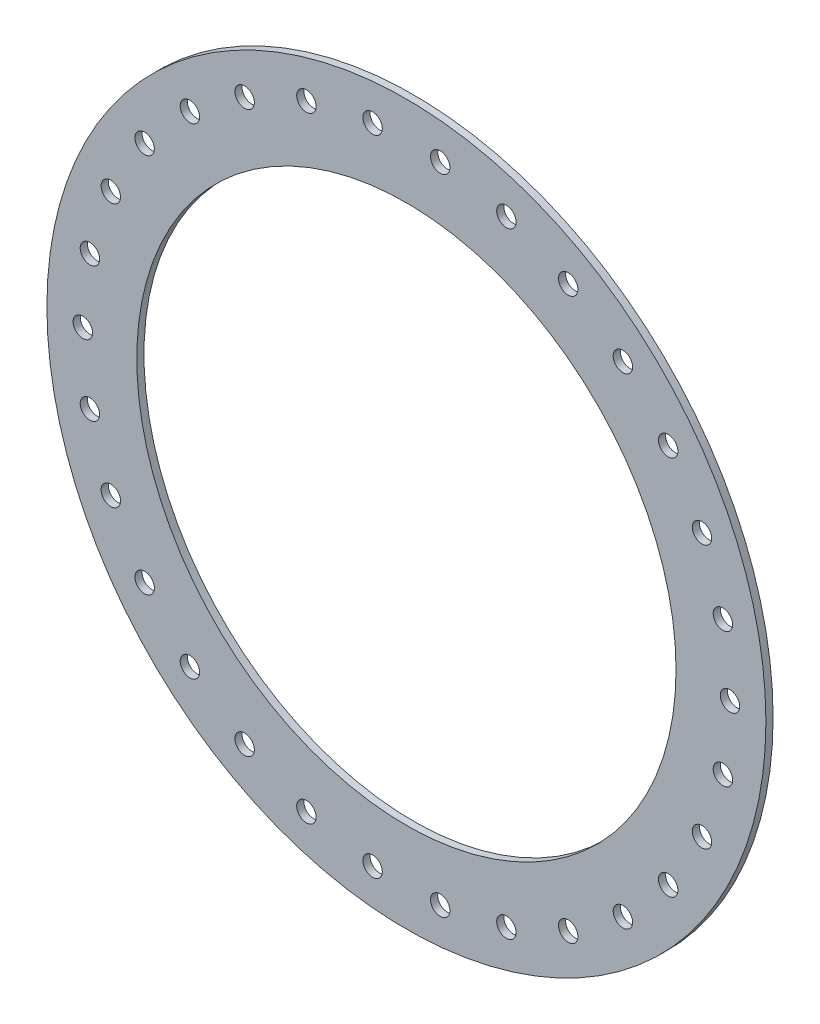
ISO-10303-21;
HEADER;
FILE_DESCRIPTION(('STEP AP214'),'2;1');
FILE_NAME('part.step','',(''),(''),'','','');
FILE_SCHEMA(('AUTOMOTIVE_DESIGN { 1 0 10303 214 1 1 1 1 }'));
ENDSEC;
DATA;
#1=APPLICATION_CONTEXT('core data for automotive mechanical design processes');
#2=APPLICATION_PROTOCOL_DEFINITION('international standard','automotive_design',2000,#1);
#3=PRODUCT_CONTEXT('',#1,'mechanical');
#4=PRODUCT('Part','Part','',(#3));
#5=PRODUCT_RELATED_PRODUCT_CATEGORY('part','',(#4));
#6=PRODUCT_DEFINITION_FORMATION('','',#4);
#7=PRODUCT_DEFINITION_CONTEXT('part definition',#1,'design');
#8=PRODUCT_DEFINITION('design','',#6,#7);
#9=PRODUCT_DEFINITION_SHAPE('','',#8);
#10=(LENGTH_UNIT() NAMED_UNIT(*) SI_UNIT(.MILLI.,.METRE.));
#11=(NAMED_UNIT(*) PLANE_ANGLE_UNIT() SI_UNIT($,.RADIAN.));
#12=(NAMED_UNIT(*) SI_UNIT($,.STERADIAN.) SOLID_ANGLE_UNIT());
#13=UNCERTAINTY_MEASURE_WITH_UNIT(LENGTH_MEASURE(1.E-05),#10,'distance_accuracy_value','');
#14=(GEOMETRIC_REPRESENTATION_CONTEXT(3) GLOBAL_UNCERTAINTY_ASSIGNED_CONTEXT((#13)) GLOBAL_UNIT_ASSIGNED_CONTEXT((#10,
#11,#12)) REPRESENTATION_CONTEXT('',''));
#15=CARTESIAN_POINT('',(0.,0.,0.));
#16=DIRECTION('',(0.,0.,1.));
#17=DIRECTION('',(1.,0.,0.));
#18=AXIS2_PLACEMENT_3D('',#15,#16,#17);
#19=CARTESIAN_POINT('',(0.,0.,4.));
#20=DIRECTION('',(0.,0.,1.));
#21=DIRECTION('',(1.,0.,0.));
#22=AXIS2_PLACEMENT_3D('',#19,#20,#21);
#23=PLANE('',#22);
#24=CARTESIAN_POINT('',(90.0000000000002,155.884572681199,4.));
#25=DIRECTION('',(0.,0.,1.));
#26=DIRECTION('',(1.,0.,0.));
#27=AXIS2_PLACEMENT_3D('',#24,#25,#26);
#28=CIRCLE('',#27,5.39999999999904);
#29=CARTESIAN_POINT('',(95.3999999999992,155.884572681199,4.));
#30=VERTEX_POINT('',#29);
#31=EDGE_CURVE('E217',#30,#30,#28,.T.);
#32=ORIENTED_EDGE('',*,*,#31,.F.);
#33=EDGE_LOOP('',(#32));
#34=FACE_BOUND('',#33,.T.);
#35=CARTESIAN_POINT('',(18.8151233881785,179.013941166289,4.));
#36=DIRECTION('',(0.,0.,1.));
#37=DIRECTION('',(1.,0.,0.));
#38=AXIS2_PLACEMENT_3D('',#35,#36,#37);
#39=CIRCLE('',#38,5.39999999999827);
#40=CARTESIAN_POINT('',(24.2151233881768,179.013941166289,4.));
#41=VERTEX_POINT('',#40);
#42=EDGE_CURVE('E205',#41,#41,#39,.T.);
#43=ORIENTED_EDGE('',*,*,#42,.F.);
#44=EDGE_LOOP('',(#43));
#45=FACE_BOUND('',#44,.T.);
#46=CARTESIAN_POINT('',(-55.6230589874907,171.190172933128,4.));
#47=DIRECTION('',(0.,0.,1.));
#48=DIRECTION('',(1.,0.,0.));
#49=AXIS2_PLACEMENT_3D('',#46,#47,#48);
#50=CIRCLE('',#49,5.39999999999888);
#51=CARTESIAN_POINT('',(-50.2230589874918,171.190172933128,4.));
#52=VERTEX_POINT('',#51);
#53=EDGE_CURVE('E193',#52,#52,#50,.T.);
#54=ORIENTED_EDGE('',*,*,#53,.F.);
#55=EDGE_LOOP('',(#54));
#56=FACE_BOUND('',#55,.T.);
#57=CARTESIAN_POINT('',(-120.443509144596,133.76606858593,4.));
#58=DIRECTION('',(0.,0.,1.));
#59=DIRECTION('',(1.,0.,0.));
#60=AXIS2_PLACEMENT_3D('',#57,#58,#59);
#61=CIRCLE('',#60,5.40000000000034);
#62=CARTESIAN_POINT('',(-115.043509144595,133.76606858593,4.));
#63=VERTEX_POINT('',#62);
#64=EDGE_CURVE('E181',#63,#63,#61,.T.);
#65=ORIENTED_EDGE('',*,*,#64,.F.);
#66=EDGE_LOOP('',(#65));
#67=FACE_BOUND('',#66,.T.);
#68=CARTESIAN_POINT('',(-164.438182375669,73.2125957536425,4.));
#69=DIRECTION('',(0.,0.,1.));
#70=DIRECTION('',(1.,0.,0.));
#71=AXIS2_PLACEMENT_3D('',#68,#69,#70);
#72=CIRCLE('',#71,5.40000000000011);
#73=CARTESIAN_POINT('',(-159.038182375669,73.2125957536425,4.));
#74=VERTEX_POINT('',#73);
#75=EDGE_CURVE('E169',#74,#74,#72,.T.);
#76=ORIENTED_EDGE('',*,*,#75,.F.);
#77=EDGE_LOOP('',(#76));
#78=FACE_BOUND('',#77,.T.);
#79=CARTESIAN_POINT('',(-180.,-1.23512311489549E-12,4.));
#80=DIRECTION('',(0.,0.,1.));
#81=DIRECTION('',(1.,0.,0.));
#82=AXIS2_PLACEMENT_3D('',#79,#80,#81);
#83=CIRCLE('',#82,5.39999999999999);
#84=CARTESIAN_POINT('',(-174.6,-1.23512311489549E-12,4.));
#85=VERTEX_POINT('',#84);
#86=EDGE_CURVE('E157',#85,#85,#83,.T.);
#87=ORIENTED_EDGE('',*,*,#86,.F.);
#88=EDGE_LOOP('',(#87));
#89=FACE_BOUND('',#88,.T.);
#90=CARTESIAN_POINT('',(-164.438182375668,-73.2125957536451,4.));
#91=DIRECTION('',(0.,0.,1.));
#92=DIRECTION('',(1.,0.,0.));
#93=AXIS2_PLACEMENT_3D('',#90,#91,#92);
#94=CIRCLE('',#93,5.40000000000006);
#95=CARTESIAN_POINT('',(-159.038182375668,-73.2125957536451,4.));
#96=VERTEX_POINT('',#95);
#97=EDGE_CURVE('E145',#96,#96,#94,.T.);
#98=ORIENTED_EDGE('',*,*,#97,.F.);
#99=EDGE_LOOP('',(#98));
#100=FACE_BOUND('',#99,.T.);
#101=CARTESIAN_POINT('',(-120.443509144595,-133.766068585931,4.));
#102=DIRECTION('',(0.,0.,1.));
#103=DIRECTION('',(1.,0.,0.));
#104=AXIS2_PLACEMENT_3D('',#101,#102,#103);
#105=CIRCLE('',#104,5.4000000000008);
#106=CARTESIAN_POINT('',(-115.043509144594,-133.766068585931,4.));
#107=VERTEX_POINT('',#106);
#108=EDGE_CURVE('E133',#107,#107,#105,.T.);
#109=ORIENTED_EDGE('',*,*,#108,.F.);
#110=EDGE_LOOP('',(#109));
#111=FACE_BOUND('',#110,.T.);
#112=CARTESIAN_POINT('',(-55.6230589874905,-171.190172933128,4.));
#113=DIRECTION('',(0.,0.,1.));
#114=DIRECTION('',(1.,0.,0.));
#115=AXIS2_PLACEMENT_3D('',#112,#113,#114);
#116=CIRCLE('',#115,5.40000000000098);
#117=CARTESIAN_POINT('',(-50.2230589874895,-171.190172933128,4.));
#118=VERTEX_POINT('',#117);
#119=EDGE_CURVE('E121',#118,#118,#116,.T.);
#120=ORIENTED_EDGE('',*,*,#119,.F.);
#121=EDGE_LOOP('',(#120));
#122=FACE_BOUND('',#121,.T.);
#123=CARTESIAN_POINT('',(18.8151233881778,-179.013941166289,4.));
#124=DIRECTION('',(0.,0.,1.));
#125=DIRECTION('',(1.,0.,0.));
#126=AXIS2_PLACEMENT_3D('',#123,#124,#125);
#127=CIRCLE('',#126,5.40000000000134);
#128=CARTESIAN_POINT('',(24.2151233881791,-179.013941166289,4.));
#129=VERTEX_POINT('',#128);
#130=EDGE_CURVE('E109',#129,#129,#127,.T.);
#131=ORIENTED_EDGE('',*,*,#130,.F.);
#132=EDGE_LOOP('',(#131));
#133=FACE_BOUND('',#132,.T.);
#134=CARTESIAN_POINT('',(90.0000000000003,-155.884572681199,4.));
#135=DIRECTION('',(0.,0.,1.));
#136=DIRECTION('',(1.,0.,0.));
#137=AXIS2_PLACEMENT_3D('',#134,#135,#136);
#138=CIRCLE('',#137,5.40000000000116);
#139=CARTESIAN_POINT('',(95.4000000000015,-155.884572681199,4.));
#140=VERTEX_POINT('',#139);
#141=EDGE_CURVE('E97',#140,#140,#138,.T.);
#142=ORIENTED_EDGE('',*,*,#141,.F.);
#143=EDGE_LOOP('',(#142));
#144=FACE_BOUND('',#143,.T.);
#145=CARTESIAN_POINT('',(145.623058987491,-105.801345412645,4.));
#146=DIRECTION('',(0.,0.,1.));
#147=DIRECTION('',(1.,0.,0.));
#148=AXIS2_PLACEMENT_3D('',#145,#146,#147);
#149=CIRCLE('',#148,5.400000000001);
#150=CARTESIAN_POINT('',(151.023058987492,-105.801345412645,4.));
#151=VERTEX_POINT('',#150);
#152=EDGE_CURVE('E85',#151,#151,#149,.T.);
#153=ORIENTED_EDGE('',*,*,#152,.F.);
#154=EDGE_LOOP('',(#153));
#155=FACE_BOUND('',#154,.T.);
#156=CARTESIAN_POINT('',(176.066568132085,-37.4241043471965,4.));
#157=DIRECTION('',(0.,0.,1.));
#158=DIRECTION('',(1.,0.,0.));
#159=AXIS2_PLACEMENT_3D('',#156,#157,#158);
#160=CIRCLE('',#159,5.40000000000047);
#161=CARTESIAN_POINT('',(181.466568132086,-37.4241043471965,4.));
#162=VERTEX_POINT('',#161);
#163=EDGE_CURVE('E73',#162,#162,#160,.T.);
#164=ORIENTED_EDGE('',*,*,#163,.F.);
#165=EDGE_LOOP('',(#164));
#166=FACE_BOUND('',#165,.T.);
#167=CARTESIAN_POINT('',(176.066568132085,37.4241043471966,4.));
#168=DIRECTION('',(0.,0.,1.));
#169=DIRECTION('',(1.,0.,0.));
#170=AXIS2_PLACEMENT_3D('',#167,#168,#169);
#171=CIRCLE('',#170,5.39999999999994);
#172=CARTESIAN_POINT('',(181.466568132085,37.4241043471966,4.));
#173=VERTEX_POINT('',#172);
#174=EDGE_CURVE('E61',#173,#173,#171,.T.);
#175=ORIENTED_EDGE('',*,*,#174,.F.);
#176=EDGE_LOOP('',(#175));
#177=FACE_BOUND('',#176,.T.);
#178=CARTESIAN_POINT('',(164.438182375668,73.2125957536444,4.));
#179=DIRECTION('',(0.,0.,1.));
#180=DIRECTION('',(1.,0.,0.));
#181=AXIS2_PLACEMENT_3D('',#178,#179,#180);
#182=CIRCLE('',#181,5.39999999999976);
#183=CARTESIAN_POINT('',(169.838182375668,73.2125957536444,4.));
#184=VERTEX_POINT('',#183);
#185=EDGE_CURVE('E49',#184,#184,#182,.T.);
#186=ORIENTED_EDGE('',*,*,#185,.F.);
#187=EDGE_LOOP('',(#186));
#188=FACE_BOUND('',#187,.T.);
#189=CARTESIAN_POINT('',(0.,0.,4.));
#190=DIRECTION('',(0.,0.,1.));
#191=DIRECTION('',(1.,0.,0.));
#192=AXIS2_PLACEMENT_3D('',#189,#190,#191);
#193=CIRCLE('',#192,200.);
#194=CARTESIAN_POINT('',(200.,0.,4.));
#195=VERTEX_POINT('',#194);
#196=EDGE_CURVE('E10',#195,#195,#193,.T.);
#197=ORIENTED_EDGE('',*,*,#196,.T.);
#198=EDGE_LOOP('',(#197));
#199=FACE_BOUND('',#198,.T.);
#200=CARTESIAN_POINT('',(0.,0.,4.));
#201=DIRECTION('',(0.,0.,1.));
#202=DIRECTION('',(1.,0.,0.));
#203=AXIS2_PLACEMENT_3D('',#200,#201,#202);
#204=CIRCLE('',#203,150.);
#205=CARTESIAN_POINT('',(150.,0.,4.));
#206=VERTEX_POINT('',#205);
#207=EDGE_CURVE('E44',#206,#206,#204,.T.);
#208=ORIENTED_EDGE('',*,*,#207,.F.);
#209=EDGE_LOOP('',(#208));
#210=FACE_BOUND('',#209,.T.);
#211=CARTESIAN_POINT('',(145.623058987491,105.801345412645,4.));
#212=DIRECTION('',(0.,0.,1.));
#213=DIRECTION('',(1.,0.,0.));
#214=AXIS2_PLACEMENT_3D('',#211,#212,#213);
#215=CIRCLE('',#214,5.39999999999932);
#216=CARTESIAN_POINT('',(151.02305898749,105.801345412645,4.));
#217=VERTEX_POINT('',#216);
#218=EDGE_CURVE('E55',#217,#217,#215,.T.);
#219=ORIENTED_EDGE('',*,*,#218,.F.);
#220=EDGE_LOOP('',(#219));
#221=FACE_BOUND('',#220,.T.);
#222=CARTESIAN_POINT('',(180.,0.,4.));
#223=DIRECTION('',(0.,0.,1.));
#224=DIRECTION('',(1.,0.,0.));
#225=AXIS2_PLACEMENT_3D('',#222,#223,#224);
#226=CIRCLE('',#225,5.40000000000017);
#227=CARTESIAN_POINT('',(185.400000000001,0.,4.));
#228=VERTEX_POINT('',#227);
#229=EDGE_CURVE('E67',#228,#228,#226,.T.);
#230=ORIENTED_EDGE('',*,*,#229,.F.);
#231=EDGE_LOOP('',(#230));
#232=FACE_BOUND('',#231,.T.);
#233=CARTESIAN_POINT('',(164.438182375668,-73.2125957536442,4.));
#234=DIRECTION('',(0.,0.,1.));
#235=DIRECTION('',(1.,0.,0.));
#236=AXIS2_PLACEMENT_3D('',#233,#234,#235);
#237=CIRCLE('',#236,5.40000000000067);
#238=CARTESIAN_POINT('',(169.838182375669,-73.2125957536442,4.));
#239=VERTEX_POINT('',#238);
#240=EDGE_CURVE('E79',#239,#239,#237,.T.);
#241=ORIENTED_EDGE('',*,*,#240,.F.);
#242=EDGE_LOOP('',(#241));
#243=FACE_BOUND('',#242,.T.);
#244=CARTESIAN_POINT('',(120.443509144595,-133.766068585931,4.));
#245=DIRECTION('',(0.,0.,1.));
#246=DIRECTION('',(1.,0.,0.));
#247=AXIS2_PLACEMENT_3D('',#244,#245,#246);
#248=CIRCLE('',#247,5.40000000000104);
#249=CARTESIAN_POINT('',(125.843509144596,-133.766068585931,4.));
#250=VERTEX_POINT('',#249);
#251=EDGE_CURVE('E91',#250,#250,#248,.T.);
#252=ORIENTED_EDGE('',*,*,#251,.F.);
#253=EDGE_LOOP('',(#252));
#254=FACE_BOUND('',#253,.T.);
#255=CARTESIAN_POINT('',(55.6230589874907,-171.190172933128,4.));
#256=DIRECTION('',(0.,0.,1.));
#257=DIRECTION('',(1.,0.,0.));
#258=AXIS2_PLACEMENT_3D('',#255,#256,#257);
#259=CIRCLE('',#258,5.40000000000138);
#260=CARTESIAN_POINT('',(61.0230589874921,-171.190172933128,4.));
#261=VERTEX_POINT('',#260);
#262=EDGE_CURVE('E103',#261,#261,#259,.T.);
#263=ORIENTED_EDGE('',*,*,#262,.F.);
#264=EDGE_LOOP('',(#263));
#265=FACE_BOUND('',#264,.T.);
#266=CARTESIAN_POINT('',(-18.8151233881776,-179.013941166289,4.));
#267=DIRECTION('',(0.,0.,1.));
#268=DIRECTION('',(1.,0.,0.));
#269=AXIS2_PLACEMENT_3D('',#266,#267,#268);
#270=CIRCLE('',#269,5.40000000000118);
#271=CARTESIAN_POINT('',(-13.4151233881764,-179.013941166289,4.));
#272=VERTEX_POINT('',#271);
#273=EDGE_CURVE('E115',#272,#272,#270,.T.);
#274=ORIENTED_EDGE('',*,*,#273,.F.);
#275=EDGE_LOOP('',(#274));
#276=FACE_BOUND('',#275,.T.);
#277=CARTESIAN_POINT('',(-89.9999999999999,-155.884572681199,4.));
#278=DIRECTION('',(0.,0.,1.));
#279=DIRECTION('',(1.,0.,0.));
#280=AXIS2_PLACEMENT_3D('',#277,#278,#279);
#281=CIRCLE('',#280,5.40000000000075);
#282=CARTESIAN_POINT('',(-84.5999999999992,-155.884572681199,4.));
#283=VERTEX_POINT('',#282);
#284=EDGE_CURVE('E127',#283,#283,#281,.T.);
#285=ORIENTED_EDGE('',*,*,#284,.F.);
#286=EDGE_LOOP('',(#285));
#287=FACE_BOUND('',#286,.T.);
#288=CARTESIAN_POINT('',(-145.623058987491,-105.801345412645,4.));
#289=DIRECTION('',(0.,0.,1.));
#290=DIRECTION('',(1.,0.,0.));
#291=AXIS2_PLACEMENT_3D('',#288,#289,#290);
#292=CIRCLE('',#291,5.40000000000052);
#293=CARTESIAN_POINT('',(-140.22305898749,-105.801345412645,4.));
#294=VERTEX_POINT('',#293);
#295=EDGE_CURVE('E139',#294,#294,#292,.T.);
#296=ORIENTED_EDGE('',*,*,#295,.F.);
#297=EDGE_LOOP('',(#296));
#298=FACE_BOUND('',#297,.T.);
#299=CARTESIAN_POINT('',(-176.066568132085,-37.4241043471978,4.));
#300=DIRECTION('',(0.,0.,1.));
#301=DIRECTION('',(1.,0.,0.));
#302=AXIS2_PLACEMENT_3D('',#299,#300,#301);
#303=CIRCLE('',#302,5.40000000000002);
#304=CARTESIAN_POINT('',(-170.666568132085,-37.4241043471978,4.));
#305=VERTEX_POINT('',#304);
#306=EDGE_CURVE('E151',#305,#305,#303,.T.);
#307=ORIENTED_EDGE('',*,*,#306,.F.);
#308=EDGE_LOOP('',(#307));
#309=FACE_BOUND('',#308,.T.);
#310=CARTESIAN_POINT('',(-176.066568132085,37.4241043471955,4.));
#311=DIRECTION('',(0.,0.,1.));
#312=DIRECTION('',(1.,0.,0.));
#313=AXIS2_PLACEMENT_3D('',#310,#311,#312);
#314=CIRCLE('',#313,5.40000000000004);
#315=CARTESIAN_POINT('',(-170.666568132085,37.4241043471955,4.));
#316=VERTEX_POINT('',#315);
#317=EDGE_CURVE('E163',#316,#316,#314,.T.);
#318=ORIENTED_EDGE('',*,*,#317,.F.);
#319=EDGE_LOOP('',(#318));
#320=FACE_BOUND('',#319,.T.);
#321=CARTESIAN_POINT('',(-145.623058987491,105.801345412644,4.));
#322=DIRECTION('',(0.,0.,1.));
#323=DIRECTION('',(1.,0.,0.));
#324=AXIS2_PLACEMENT_3D('',#321,#322,#323);
#325=CIRCLE('',#324,5.40000000000024);
#326=CARTESIAN_POINT('',(-140.223058987491,105.801345412644,4.));
#327=VERTEX_POINT('',#326);
#328=EDGE_CURVE('E175',#327,#327,#325,.T.);
#329=ORIENTED_EDGE('',*,*,#328,.F.);
#330=EDGE_LOOP('',(#329));
#331=FACE_BOUND('',#330,.T.);
#332=CARTESIAN_POINT('',(-90.0000000000019,155.884572681198,4.));
#333=DIRECTION('',(0.,0.,1.));
#334=DIRECTION('',(1.,0.,0.));
#335=AXIS2_PLACEMENT_3D('',#332,#333,#334);
#336=CIRCLE('',#335,5.40000000000049);
#337=CARTESIAN_POINT('',(-84.6000000000014,155.884572681198,4.));
#338=VERTEX_POINT('',#337);
#339=EDGE_CURVE('E187',#338,#338,#336,.T.);
#340=ORIENTED_EDGE('',*,*,#339,.F.);
#341=EDGE_LOOP('',(#340));
#342=FACE_BOUND('',#341,.T.);
#343=CARTESIAN_POINT('',(-18.8151233881776,179.013941166289,4.));
#344=DIRECTION('',(0.,0.,1.));
#345=DIRECTION('',(1.,0.,0.));
#346=AXIS2_PLACEMENT_3D('',#343,#344,#345);
#347=CIRCLE('',#346,5.39999999999871);
#348=CARTESIAN_POINT('',(-13.4151233881788,179.013941166289,4.));
#349=VERTEX_POINT('',#348);
#350=EDGE_CURVE('E199',#349,#349,#347,.T.);
#351=ORIENTED_EDGE('',*,*,#350,.F.);
#352=EDGE_LOOP('',(#351));
#353=FACE_BOUND('',#352,.T.);
#354=CARTESIAN_POINT('',(55.6230589874906,171.190172933128,4.));
#355=DIRECTION('',(0.,0.,1.));
#356=DIRECTION('',(1.,0.,0.));
#357=AXIS2_PLACEMENT_3D('',#354,#355,#356);
#358=CIRCLE('',#357,5.39999999999888);
#359=CARTESIAN_POINT('',(61.0230589874895,171.190172933128,4.));
#360=VERTEX_POINT('',#359);
#361=EDGE_CURVE('E211',#360,#360,#358,.T.);
#362=ORIENTED_EDGE('',*,*,#361,.F.);
#363=EDGE_LOOP('',(#362));
#364=FACE_BOUND('',#363,.T.);
#365=CARTESIAN_POINT('',(120.443509144595,133.766068585931,4.));
#366=DIRECTION('',(0.,0.,1.));
#367=DIRECTION('',(1.,0.,0.));
#368=AXIS2_PLACEMENT_3D('',#365,#366,#367);
#369=CIRCLE('',#368,5.39999999999919);
#370=CARTESIAN_POINT('',(125.843509144594,133.766068585931,4.));
#371=VERTEX_POINT('',#370);
#372=EDGE_CURVE('E223',#371,#371,#369,.T.);
#373=ORIENTED_EDGE('',*,*,#372,.F.);
#374=EDGE_LOOP('',(#373));
#375=FACE_BOUND('',#374,.T.);
#376=ADVANCED_FACE('F33',(#34,#45,#56,#67,#78,#89,#100,#111,#122,#133,#144,#155,#166,#177,#188,
#199,#210,#221,#232,#243,#254,#265,#276,#287,#298,#309,#320,#331,#342,#353,#364,#375),#23,.T.);
#377=CARTESIAN_POINT('',(0.,0.,0.));
#378=DIRECTION('',(0.,0.,1.));
#379=DIRECTION('',(1.,0.,0.));
#380=AXIS2_PLACEMENT_3D('',#377,#378,#379);
#381=PLANE('',#380);
#382=CARTESIAN_POINT('',(0.,0.,0.));
#383=DIRECTION('',(0.,0.,1.));
#384=DIRECTION('',(1.,0.,0.));
#385=AXIS2_PLACEMENT_3D('',#382,#383,#384);
#386=CIRCLE('',#385,200.);
#387=CARTESIAN_POINT('',(200.,0.,0.));
#388=VERTEX_POINT('',#387);
#389=EDGE_CURVE('E37',#388,#388,#386,.T.);
#390=ORIENTED_EDGE('',*,*,#389,.F.);
#391=EDGE_LOOP('',(#390));
#392=FACE_BOUND('',#391,.T.);
#393=CARTESIAN_POINT('',(0.,0.,0.));
#394=DIRECTION('',(0.,0.,1.));
#395=DIRECTION('',(1.,0.,0.));
#396=AXIS2_PLACEMENT_3D('',#393,#394,#395);
#397=CIRCLE('',#396,150.);
#398=CARTESIAN_POINT('',(150.,0.,0.));
#399=VERTEX_POINT('',#398);
#400=EDGE_CURVE('E46',#399,#399,#397,.T.);
#401=ORIENTED_EDGE('',*,*,#400,.T.);
#402=EDGE_LOOP('',(#401));
#403=FACE_BOUND('',#402,.T.);
#404=CARTESIAN_POINT('',(164.438182375668,73.2125957536444,0.));
#405=DIRECTION('',(0.,0.,1.));
#406=DIRECTION('',(1.,0.,0.));
#407=AXIS2_PLACEMENT_3D('',#404,#405,#406);
#408=CIRCLE('',#407,5.39999999999976);
#409=CARTESIAN_POINT('',(169.838182375668,73.2125957536444,0.));
#410=VERTEX_POINT('',#409);
#411=EDGE_CURVE('E52',#410,#410,#408,.T.);
#412=ORIENTED_EDGE('',*,*,#411,.T.);
#413=EDGE_LOOP('',(#412));
#414=FACE_BOUND('',#413,.T.);
#415=CARTESIAN_POINT('',(145.623058987491,105.801345412645,0.));
#416=DIRECTION('',(0.,0.,1.));
#417=DIRECTION('',(1.,0.,0.));
#418=AXIS2_PLACEMENT_3D('',#415,#416,#417);
#419=CIRCLE('',#418,5.39999999999932);
#420=CARTESIAN_POINT('',(151.02305898749,105.801345412645,0.));
#421=VERTEX_POINT('',#420);
#422=EDGE_CURVE('E58',#421,#421,#419,.T.);
#423=ORIENTED_EDGE('',*,*,#422,.T.);
#424=EDGE_LOOP('',(#423));
#425=FACE_BOUND('',#424,.T.);
#426=CARTESIAN_POINT('',(176.066568132085,37.4241043471966,0.));
#427=DIRECTION('',(0.,0.,1.));
#428=DIRECTION('',(1.,0.,0.));
#429=AXIS2_PLACEMENT_3D('',#426,#427,#428);
#430=CIRCLE('',#429,5.39999999999994);
#431=CARTESIAN_POINT('',(181.466568132085,37.4241043471966,0.));
#432=VERTEX_POINT('',#431);
#433=EDGE_CURVE('E64',#432,#432,#430,.T.);
#434=ORIENTED_EDGE('',*,*,#433,.T.);
#435=EDGE_LOOP('',(#434));
#436=FACE_BOUND('',#435,.T.);
#437=CARTESIAN_POINT('',(180.,0.,0.));
#438=DIRECTION('',(0.,0.,1.));
#439=DIRECTION('',(1.,0.,0.));
#440=AXIS2_PLACEMENT_3D('',#437,#438,#439);
#441=CIRCLE('',#440,5.40000000000017);
#442=CARTESIAN_POINT('',(185.400000000001,0.,0.));
#443=VERTEX_POINT('',#442);
#444=EDGE_CURVE('E70',#443,#443,#441,.T.);
#445=ORIENTED_EDGE('',*,*,#444,.T.);
#446=EDGE_LOOP('',(#445));
#447=FACE_BOUND('',#446,.T.);
#448=CARTESIAN_POINT('',(176.066568132085,-37.4241043471965,0.));
#449=DIRECTION('',(0.,0.,1.));
#450=DIRECTION('',(1.,0.,0.));
#451=AXIS2_PLACEMENT_3D('',#448,#449,#450);
#452=CIRCLE('',#451,5.40000000000047);
#453=CARTESIAN_POINT('',(181.466568132086,-37.4241043471965,0.));
#454=VERTEX_POINT('',#453);
#455=EDGE_CURVE('E76',#454,#454,#452,.T.);
#456=ORIENTED_EDGE('',*,*,#455,.T.);
#457=EDGE_LOOP('',(#456));
#458=FACE_BOUND('',#457,.T.);
#459=CARTESIAN_POINT('',(164.438182375668,-73.2125957536442,0.));
#460=DIRECTION('',(0.,0.,1.));
#461=DIRECTION('',(1.,0.,0.));
#462=AXIS2_PLACEMENT_3D('',#459,#460,#461);
#463=CIRCLE('',#462,5.40000000000067);
#464=CARTESIAN_POINT('',(169.838182375669,-73.2125957536442,0.));
#465=VERTEX_POINT('',#464);
#466=EDGE_CURVE('E82',#465,#465,#463,.T.);
#467=ORIENTED_EDGE('',*,*,#466,.T.);
#468=EDGE_LOOP('',(#467));
#469=FACE_BOUND('',#468,.T.);
#470=CARTESIAN_POINT('',(145.623058987491,-105.801345412645,0.));
#471=DIRECTION('',(0.,0.,1.));
#472=DIRECTION('',(1.,0.,0.));
#473=AXIS2_PLACEMENT_3D('',#470,#471,#472);
#474=CIRCLE('',#473,5.400000000001);
#475=CARTESIAN_POINT('',(151.023058987492,-105.801345412645,0.));
#476=VERTEX_POINT('',#475);
#477=EDGE_CURVE('E88',#476,#476,#474,.T.);
#478=ORIENTED_EDGE('',*,*,#477,.T.);
#479=EDGE_LOOP('',(#478));
#480=FACE_BOUND('',#479,.T.);
#481=CARTESIAN_POINT('',(120.443509144595,-133.766068585931,0.));
#482=DIRECTION('',(0.,0.,1.));
#483=DIRECTION('',(1.,0.,0.));
#484=AXIS2_PLACEMENT_3D('',#481,#482,#483);
#485=CIRCLE('',#484,5.40000000000104);
#486=CARTESIAN_POINT('',(125.843509144596,-133.766068585931,0.));
#487=VERTEX_POINT('',#486);
#488=EDGE_CURVE('E94',#487,#487,#485,.T.);
#489=ORIENTED_EDGE('',*,*,#488,.T.);
#490=EDGE_LOOP('',(#489));
#491=FACE_BOUND('',#490,.T.);
#492=CARTESIAN_POINT('',(90.0000000000003,-155.884572681199,0.));
#493=DIRECTION('',(0.,0.,1.));
#494=DIRECTION('',(1.,0.,0.));
#495=AXIS2_PLACEMENT_3D('',#492,#493,#494);
#496=CIRCLE('',#495,5.40000000000116);
#497=CARTESIAN_POINT('',(95.4000000000015,-155.884572681199,0.));
#498=VERTEX_POINT('',#497);
#499=EDGE_CURVE('E100',#498,#498,#496,.T.);
#500=ORIENTED_EDGE('',*,*,#499,.T.);
#501=EDGE_LOOP('',(#500));
#502=FACE_BOUND('',#501,.T.);
#503=CARTESIAN_POINT('',(55.6230589874907,-171.190172933128,0.));
#504=DIRECTION('',(0.,0.,1.));
#505=DIRECTION('',(1.,0.,0.));
#506=AXIS2_PLACEMENT_3D('',#503,#504,#505);
#507=CIRCLE('',#506,5.40000000000138);
#508=CARTESIAN_POINT('',(61.0230589874921,-171.190172933128,0.));
#509=VERTEX_POINT('',#508);
#510=EDGE_CURVE('E106',#509,#509,#507,.T.);
#511=ORIENTED_EDGE('',*,*,#510,.T.);
#512=EDGE_LOOP('',(#511));
#513=FACE_BOUND('',#512,.T.);
#514=CARTESIAN_POINT('',(18.8151233881778,-179.013941166289,0.));
#515=DIRECTION('',(0.,0.,1.));
#516=DIRECTION('',(1.,0.,0.));
#517=AXIS2_PLACEMENT_3D('',#514,#515,#516);
#518=CIRCLE('',#517,5.40000000000134);
#519=CARTESIAN_POINT('',(24.2151233881791,-179.013941166289,0.));
#520=VERTEX_POINT('',#519);
#521=EDGE_CURVE('E112',#520,#520,#518,.T.);
#522=ORIENTED_EDGE('',*,*,#521,.T.);
#523=EDGE_LOOP('',(#522));
#524=FACE_BOUND('',#523,.T.);
#525=CARTESIAN_POINT('',(-18.8151233881776,-179.013941166289,0.));
#526=DIRECTION('',(0.,0.,1.));
#527=DIRECTION('',(1.,0.,0.));
#528=AXIS2_PLACEMENT_3D('',#525,#526,#527);
#529=CIRCLE('',#528,5.40000000000118);
#530=CARTESIAN_POINT('',(-13.4151233881764,-179.013941166289,0.));
#531=VERTEX_POINT('',#530);
#532=EDGE_CURVE('E118',#531,#531,#529,.T.);
#533=ORIENTED_EDGE('',*,*,#532,.T.);
#534=EDGE_LOOP('',(#533));
#535=FACE_BOUND('',#534,.T.);
#536=CARTESIAN_POINT('',(-55.6230589874905,-171.190172933128,0.));
#537=DIRECTION('',(0.,0.,1.));
#538=DIRECTION('',(1.,0.,0.));
#539=AXIS2_PLACEMENT_3D('',#536,#537,#538);
#540=CIRCLE('',#539,5.40000000000098);
#541=CARTESIAN_POINT('',(-50.2230589874895,-171.190172933128,0.));
#542=VERTEX_POINT('',#541);
#543=EDGE_CURVE('E124',#542,#542,#540,.T.);
#544=ORIENTED_EDGE('',*,*,#543,.T.);
#545=EDGE_LOOP('',(#544));
#546=FACE_BOUND('',#545,.T.);
#547=CARTESIAN_POINT('',(-89.9999999999999,-155.884572681199,0.));
#548=DIRECTION('',(0.,0.,1.));
#549=DIRECTION('',(1.,0.,0.));
#550=AXIS2_PLACEMENT_3D('',#547,#548,#549);
#551=CIRCLE('',#550,5.40000000000075);
#552=CARTESIAN_POINT('',(-84.5999999999992,-155.884572681199,0.));
#553=VERTEX_POINT('',#552);
#554=EDGE_CURVE('E130',#553,#553,#551,.T.);
#555=ORIENTED_EDGE('',*,*,#554,.T.);
#556=EDGE_LOOP('',(#555));
#557=FACE_BOUND('',#556,.T.);
#558=CARTESIAN_POINT('',(-120.443509144595,-133.766068585931,0.));
#559=DIRECTION('',(0.,0.,1.));
#560=DIRECTION('',(1.,0.,0.));
#561=AXIS2_PLACEMENT_3D('',#558,#559,#560);
#562=CIRCLE('',#561,5.4000000000008);
#563=CARTESIAN_POINT('',(-115.043509144594,-133.766068585931,0.));
#564=VERTEX_POINT('',#563);
#565=EDGE_CURVE('E136',#564,#564,#562,.T.);
#566=ORIENTED_EDGE('',*,*,#565,.T.);
#567=EDGE_LOOP('',(#566));
#568=FACE_BOUND('',#567,.T.);
#569=CARTESIAN_POINT('',(-145.623058987491,-105.801345412645,0.));
#570=DIRECTION('',(0.,0.,1.));
#571=DIRECTION('',(1.,0.,0.));
#572=AXIS2_PLACEMENT_3D('',#569,#570,#571);
#573=CIRCLE('',#572,5.40000000000052);
#574=CARTESIAN_POINT('',(-140.22305898749,-105.801345412645,0.));
#575=VERTEX_POINT('',#574);
#576=EDGE_CURVE('E142',#575,#575,#573,.T.);
#577=ORIENTED_EDGE('',*,*,#576,.T.);
#578=EDGE_LOOP('',(#577));
#579=FACE_BOUND('',#578,.T.);
#580=CARTESIAN_POINT('',(-164.438182375668,-73.2125957536451,0.));
#581=DIRECTION('',(0.,0.,1.));
#582=DIRECTION('',(1.,0.,0.));
#583=AXIS2_PLACEMENT_3D('',#580,#581,#582);
#584=CIRCLE('',#583,5.40000000000006);
#585=CARTESIAN_POINT('',(-159.038182375668,-73.2125957536451,0.));
#586=VERTEX_POINT('',#585);
#587=EDGE_CURVE('E148',#586,#586,#584,.T.);
#588=ORIENTED_EDGE('',*,*,#587,.T.);
#589=EDGE_LOOP('',(#588));
#590=FACE_BOUND('',#589,.T.);
#591=CARTESIAN_POINT('',(-176.066568132085,-37.4241043471978,0.));
#592=DIRECTION('',(0.,0.,1.));
#593=DIRECTION('',(1.,0.,0.));
#594=AXIS2_PLACEMENT_3D('',#591,#592,#593);
#595=CIRCLE('',#594,5.40000000000002);
#596=CARTESIAN_POINT('',(-170.666568132085,-37.4241043471978,0.));
#597=VERTEX_POINT('',#596);
#598=EDGE_CURVE('E154',#597,#597,#595,.T.);
#599=ORIENTED_EDGE('',*,*,#598,.T.);
#600=EDGE_LOOP('',(#599));
#601=FACE_BOUND('',#600,.T.);
#602=CARTESIAN_POINT('',(-180.,-1.23512311489549E-12,0.));
#603=DIRECTION('',(0.,0.,1.));
#604=DIRECTION('',(1.,0.,0.));
#605=AXIS2_PLACEMENT_3D('',#602,#603,#604);
#606=CIRCLE('',#605,5.39999999999999);
#607=CARTESIAN_POINT('',(-174.6,-1.23512311489549E-12,0.));
#608=VERTEX_POINT('',#607);
#609=EDGE_CURVE('E160',#608,#608,#606,.T.);
#610=ORIENTED_EDGE('',*,*,#609,.T.);
#611=EDGE_LOOP('',(#610));
#612=FACE_BOUND('',#611,.T.);
#613=CARTESIAN_POINT('',(-176.066568132085,37.4241043471955,0.));
#614=DIRECTION('',(0.,0.,1.));
#615=DIRECTION('',(1.,0.,0.));
#616=AXIS2_PLACEMENT_3D('',#613,#614,#615);
#617=CIRCLE('',#616,5.40000000000004);
#618=CARTESIAN_POINT('',(-170.666568132085,37.4241043471955,0.));
#619=VERTEX_POINT('',#618);
#620=EDGE_CURVE('E166',#619,#619,#617,.T.);
#621=ORIENTED_EDGE('',*,*,#620,.T.);
#622=EDGE_LOOP('',(#621));
#623=FACE_BOUND('',#622,.T.);
#624=CARTESIAN_POINT('',(-164.438182375669,73.2125957536425,0.));
#625=DIRECTION('',(0.,0.,1.));
#626=DIRECTION('',(1.,0.,0.));
#627=AXIS2_PLACEMENT_3D('',#624,#625,#626);
#628=CIRCLE('',#627,5.40000000000011);
#629=CARTESIAN_POINT('',(-159.038182375669,73.2125957536425,0.));
#630=VERTEX_POINT('',#629);
#631=EDGE_CURVE('E172',#630,#630,#628,.T.);
#632=ORIENTED_EDGE('',*,*,#631,.T.);
#633=EDGE_LOOP('',(#632));
#634=FACE_BOUND('',#633,.T.);
#635=CARTESIAN_POINT('',(-145.623058987491,105.801345412644,0.));
#636=DIRECTION('',(0.,0.,1.));
#637=DIRECTION('',(1.,0.,0.));
#638=AXIS2_PLACEMENT_3D('',#635,#636,#637);
#639=CIRCLE('',#638,5.40000000000024);
#640=CARTESIAN_POINT('',(-140.223058987491,105.801345412644,0.));
#641=VERTEX_POINT('',#640);
#642=EDGE_CURVE('E178',#641,#641,#639,.T.);
#643=ORIENTED_EDGE('',*,*,#642,.T.);
#644=EDGE_LOOP('',(#643));
#645=FACE_BOUND('',#644,.T.);
#646=CARTESIAN_POINT('',(-120.443509144596,133.76606858593,0.));
#647=DIRECTION('',(0.,0.,1.));
#648=DIRECTION('',(1.,0.,0.));
#649=AXIS2_PLACEMENT_3D('',#646,#647,#648);
#650=CIRCLE('',#649,5.40000000000034);
#651=CARTESIAN_POINT('',(-115.043509144595,133.76606858593,0.));
#652=VERTEX_POINT('',#651);
#653=EDGE_CURVE('E184',#652,#652,#650,.T.);
#654=ORIENTED_EDGE('',*,*,#653,.T.);
#655=EDGE_LOOP('',(#654));
#656=FACE_BOUND('',#655,.T.);
#657=CARTESIAN_POINT('',(-90.0000000000019,155.884572681198,0.));
#658=DIRECTION('',(0.,0.,1.));
#659=DIRECTION('',(1.,0.,0.));
#660=AXIS2_PLACEMENT_3D('',#657,#658,#659);
#661=CIRCLE('',#660,5.40000000000049);
#662=CARTESIAN_POINT('',(-84.6000000000014,155.884572681198,0.));
#663=VERTEX_POINT('',#662);
#664=EDGE_CURVE('E190',#663,#663,#661,.T.);
#665=ORIENTED_EDGE('',*,*,#664,.T.);
#666=EDGE_LOOP('',(#665));
#667=FACE_BOUND('',#666,.T.);
#668=CARTESIAN_POINT('',(-55.6230589874907,171.190172933128,0.));
#669=DIRECTION('',(0.,0.,1.));
#670=DIRECTION('',(1.,0.,0.));
#671=AXIS2_PLACEMENT_3D('',#668,#669,#670);
#672=CIRCLE('',#671,5.39999999999888);
#673=CARTESIAN_POINT('',(-50.2230589874918,171.190172933128,0.));
#674=VERTEX_POINT('',#673);
#675=EDGE_CURVE('E196',#674,#674,#672,.T.);
#676=ORIENTED_EDGE('',*,*,#675,.T.);
#677=EDGE_LOOP('',(#676));
#678=FACE_BOUND('',#677,.T.);
#679=CARTESIAN_POINT('',(-18.8151233881776,179.013941166289,0.));
#680=DIRECTION('',(0.,0.,1.));
#681=DIRECTION('',(1.,0.,0.));
#682=AXIS2_PLACEMENT_3D('',#679,#680,#681);
#683=CIRCLE('',#682,5.39999999999871);
#684=CARTESIAN_POINT('',(-13.4151233881788,179.013941166289,0.));
#685=VERTEX_POINT('',#684);
#686=EDGE_CURVE('E202',#685,#685,#683,.T.);
#687=ORIENTED_EDGE('',*,*,#686,.T.);
#688=EDGE_LOOP('',(#687));
#689=FACE_BOUND('',#688,.T.);
#690=CARTESIAN_POINT('',(18.8151233881785,179.013941166289,0.));
#691=DIRECTION('',(0.,0.,1.));
#692=DIRECTION('',(1.,0.,0.));
#693=AXIS2_PLACEMENT_3D('',#690,#691,#692);
#694=CIRCLE('',#693,5.39999999999827);
#695=CARTESIAN_POINT('',(24.2151233881768,179.013941166289,0.));
#696=VERTEX_POINT('',#695);
#697=EDGE_CURVE('E208',#696,#696,#694,.T.);
#698=ORIENTED_EDGE('',*,*,#697,.T.);
#699=EDGE_LOOP('',(#698));
#700=FACE_BOUND('',#699,.T.);
#701=CARTESIAN_POINT('',(55.6230589874906,171.190172933128,0.));
#702=DIRECTION('',(0.,0.,1.));
#703=DIRECTION('',(1.,0.,0.));
#704=AXIS2_PLACEMENT_3D('',#701,#702,#703);
#705=CIRCLE('',#704,5.39999999999888);
#706=CARTESIAN_POINT('',(61.0230589874895,171.190172933128,0.));
#707=VERTEX_POINT('',#706);
#708=EDGE_CURVE('E214',#707,#707,#705,.T.);
#709=ORIENTED_EDGE('',*,*,#708,.T.);
#710=EDGE_LOOP('',(#709));
#711=FACE_BOUND('',#710,.T.);
#712=CARTESIAN_POINT('',(90.0000000000002,155.884572681199,0.));
#713=DIRECTION('',(0.,0.,1.));
#714=DIRECTION('',(1.,0.,0.));
#715=AXIS2_PLACEMENT_3D('',#712,#713,#714);
#716=CIRCLE('',#715,5.39999999999904);
#717=CARTESIAN_POINT('',(95.3999999999992,155.884572681199,0.));
#718=VERTEX_POINT('',#717);
#719=EDGE_CURVE('E220',#718,#718,#716,.T.);
#720=ORIENTED_EDGE('',*,*,#719,.T.);
#721=EDGE_LOOP('',(#720));
#722=FACE_BOUND('',#721,.T.);
#723=CARTESIAN_POINT('',(120.443509144595,133.766068585931,0.));
#724=DIRECTION('',(0.,0.,1.));
#725=DIRECTION('',(1.,0.,0.));
#726=AXIS2_PLACEMENT_3D('',#723,#724,#725);
#727=CIRCLE('',#726,5.39999999999919);
#728=CARTESIAN_POINT('',(125.843509144594,133.766068585931,0.));
#729=VERTEX_POINT('',#728);
#730=EDGE_CURVE('E226',#729,#729,#727,.T.);
#731=ORIENTED_EDGE('',*,*,#730,.T.);
#732=EDGE_LOOP('',(#731));
#733=FACE_BOUND('',#732,.T.);
#734=ADVANCED_FACE('F236',(#392,#403,#414,#425,#436,#447,#458,#469,#480,#491,#502,#513,#524,
#535,#546,#557,#568,#579,#590,#601,#612,#623,#634,#645,#656,#667,#678,#689,#700,#711,#722,#733),
#381,.F.);
#735=CARTESIAN_POINT('',(0.,0.,4.));
#736=DIRECTION('',(0.,0.,-1.));
#737=DIRECTION('',(-1.,0.,0.));
#738=AXIS2_PLACEMENT_3D('',#735,#736,#737);
#739=CYLINDRICAL_SURFACE('',#738,200.);
#740=ORIENTED_EDGE('',*,*,#196,.F.);
#741=EDGE_LOOP('',(#740));
#742=FACE_BOUND('',#741,.T.);
#743=ORIENTED_EDGE('',*,*,#389,.T.);
#744=EDGE_LOOP('',(#743));
#745=FACE_BOUND('',#744,.T.);
#746=ADVANCED_FACE('F35',(#742,#745),#739,.T.);
#747=CARTESIAN_POINT('',(0.,0.,4.));
#748=DIRECTION('',(0.,0.,-1.));
#749=DIRECTION('',(-1.,0.,0.));
#750=AXIS2_PLACEMENT_3D('',#747,#748,#749);
#751=CYLINDRICAL_SURFACE('',#750,150.);
#752=ORIENTED_EDGE('',*,*,#207,.T.);
#753=EDGE_LOOP('',(#752));
#754=FACE_BOUND('',#753,.T.);
#755=ORIENTED_EDGE('',*,*,#400,.F.);
#756=EDGE_LOOP('',(#755));
#757=FACE_BOUND('',#756,.T.);
#758=ADVANCED_FACE('F246',(#754,#757),#751,.F.);
#759=CARTESIAN_POINT('',(164.438182375668,73.2125957536444,4.));
#760=DIRECTION('',(0.,0.,-1.));
#761=DIRECTION('',(-1.,0.,0.));
#762=AXIS2_PLACEMENT_3D('',#759,#760,#761);
#763=CYLINDRICAL_SURFACE('',#762,5.39999999999976);
#764=ORIENTED_EDGE('',*,*,#185,.T.);
#765=EDGE_LOOP('',(#764));
#766=FACE_BOUND('',#765,.T.);
#767=ORIENTED_EDGE('',*,*,#411,.F.);
#768=EDGE_LOOP('',(#767));
#769=FACE_BOUND('',#768,.T.);
#770=ADVANCED_FACE('F249',(#766,#769),#763,.F.);
#771=CARTESIAN_POINT('',(145.623058987491,105.801345412645,4.));
#772=DIRECTION('',(0.,0.,-1.));
#773=DIRECTION('',(-1.,0.,0.));
#774=AXIS2_PLACEMENT_3D('',#771,#772,#773);
#775=CYLINDRICAL_SURFACE('',#774,5.39999999999932);
#776=ORIENTED_EDGE('',*,*,#218,.T.);
#777=EDGE_LOOP('',(#776));
#778=FACE_BOUND('',#777,.T.);
#779=ORIENTED_EDGE('',*,*,#422,.F.);
#780=EDGE_LOOP('',(#779));
#781=FACE_BOUND('',#780,.T.);
#782=ADVANCED_FACE('F253',(#778,#781),#775,.F.);
#783=CARTESIAN_POINT('',(176.066568132085,37.4241043471966,4.));
#784=DIRECTION('',(0.,0.,-1.));
#785=DIRECTION('',(-1.,0.,0.));
#786=AXIS2_PLACEMENT_3D('',#783,#784,#785);
#787=CYLINDRICAL_SURFACE('',#786,5.39999999999994);
#788=ORIENTED_EDGE('',*,*,#174,.T.);
#789=EDGE_LOOP('',(#788));
#790=FACE_BOUND('',#789,.T.);
#791=ORIENTED_EDGE('',*,*,#433,.F.);
#792=EDGE_LOOP('',(#791));
#793=FACE_BOUND('',#792,.T.);
#794=ADVANCED_FACE('F257',(#790,#793),#787,.F.);
#795=CARTESIAN_POINT('',(180.,0.,4.));
#796=DIRECTION('',(0.,0.,-1.));
#797=DIRECTION('',(-1.,0.,0.));
#798=AXIS2_PLACEMENT_3D('',#795,#796,#797);
#799=CYLINDRICAL_SURFACE('',#798,5.40000000000017);
#800=ORIENTED_EDGE('',*,*,#229,.T.);
#801=EDGE_LOOP('',(#800));
#802=FACE_BOUND('',#801,.T.);
#803=ORIENTED_EDGE('',*,*,#444,.F.);
#804=EDGE_LOOP('',(#803));
#805=FACE_BOUND('',#804,.T.);
#806=ADVANCED_FACE('F261',(#802,#805),#799,.F.);
#807=CARTESIAN_POINT('',(176.066568132085,-37.4241043471965,4.));
#808=DIRECTION('',(0.,0.,-1.));
#809=DIRECTION('',(-1.,0.,0.));
#810=AXIS2_PLACEMENT_3D('',#807,#808,#809);
#811=CYLINDRICAL_SURFACE('',#810,5.40000000000047);
#812=ORIENTED_EDGE('',*,*,#163,.T.);
#813=EDGE_LOOP('',(#812));
#814=FACE_BOUND('',#813,.T.);
#815=ORIENTED_EDGE('',*,*,#455,.F.);
#816=EDGE_LOOP('',(#815));
#817=FACE_BOUND('',#816,.T.);
#818=ADVANCED_FACE('F265',(#814,#817),#811,.F.);
#819=CARTESIAN_POINT('',(164.438182375668,-73.2125957536442,4.));
#820=DIRECTION('',(0.,0.,-1.));
#821=DIRECTION('',(-1.,0.,0.));
#822=AXIS2_PLACEMENT_3D('',#819,#820,#821);
#823=CYLINDRICAL_SURFACE('',#822,5.40000000000067);
#824=ORIENTED_EDGE('',*,*,#240,.T.);
#825=EDGE_LOOP('',(#824));
#826=FACE_BOUND('',#825,.T.);
#827=ORIENTED_EDGE('',*,*,#466,.F.);
#828=EDGE_LOOP('',(#827));
#829=FACE_BOUND('',#828,.T.);
#830=ADVANCED_FACE('F269',(#826,#829),#823,.F.);
#831=CARTESIAN_POINT('',(145.623058987491,-105.801345412645,4.));
#832=DIRECTION('',(0.,0.,-1.));
#833=DIRECTION('',(-1.,0.,0.));
#834=AXIS2_PLACEMENT_3D('',#831,#832,#833);
#835=CYLINDRICAL_SURFACE('',#834,5.400000000001);
#836=ORIENTED_EDGE('',*,*,#152,.T.);
#837=EDGE_LOOP('',(#836));
#838=FACE_BOUND('',#837,.T.);
#839=ORIENTED_EDGE('',*,*,#477,.F.);
#840=EDGE_LOOP('',(#839));
#841=FACE_BOUND('',#840,.T.);
#842=ADVANCED_FACE('F273',(#838,#841),#835,.F.);
#843=CARTESIAN_POINT('',(120.443509144595,-133.766068585931,4.));
#844=DIRECTION('',(0.,0.,-1.));
#845=DIRECTION('',(-1.,0.,0.));
#846=AXIS2_PLACEMENT_3D('',#843,#844,#845);
#847=CYLINDRICAL_SURFACE('',#846,5.40000000000104);
#848=ORIENTED_EDGE('',*,*,#251,.T.);
#849=EDGE_LOOP('',(#848));
#850=FACE_BOUND('',#849,.T.);
#851=ORIENTED_EDGE('',*,*,#488,.F.);
#852=EDGE_LOOP('',(#851));
#853=FACE_BOUND('',#852,.T.);
#854=ADVANCED_FACE('F277',(#850,#853),#847,.F.);
#855=CARTESIAN_POINT('',(90.0000000000003,-155.884572681199,4.));
#856=DIRECTION('',(0.,0.,-1.));
#857=DIRECTION('',(-1.,0.,0.));
#858=AXIS2_PLACEMENT_3D('',#855,#856,#857);
#859=CYLINDRICAL_SURFACE('',#858,5.40000000000116);
#860=ORIENTED_EDGE('',*,*,#141,.T.);
#861=EDGE_LOOP('',(#860));
#862=FACE_BOUND('',#861,.T.);
#863=ORIENTED_EDGE('',*,*,#499,.F.);
#864=EDGE_LOOP('',(#863));
#865=FACE_BOUND('',#864,.T.);
#866=ADVANCED_FACE('F281',(#862,#865),#859,.F.);
#867=CARTESIAN_POINT('',(55.6230589874907,-171.190172933128,4.));
#868=DIRECTION('',(0.,0.,-1.));
#869=DIRECTION('',(-1.,0.,0.));
#870=AXIS2_PLACEMENT_3D('',#867,#868,#869);
#871=CYLINDRICAL_SURFACE('',#870,5.40000000000138);
#872=ORIENTED_EDGE('',*,*,#262,.T.);
#873=EDGE_LOOP('',(#872));
#874=FACE_BOUND('',#873,.T.);
#875=ORIENTED_EDGE('',*,*,#510,.F.);
#876=EDGE_LOOP('',(#875));
#877=FACE_BOUND('',#876,.T.);
#878=ADVANCED_FACE('F285',(#874,#877),#871,.F.);
#879=CARTESIAN_POINT('',(18.8151233881778,-179.013941166289,4.));
#880=DIRECTION('',(0.,0.,-1.));
#881=DIRECTION('',(-1.,0.,0.));
#882=AXIS2_PLACEMENT_3D('',#879,#880,#881);
#883=CYLINDRICAL_SURFACE('',#882,5.40000000000134);
#884=ORIENTED_EDGE('',*,*,#130,.T.);
#885=EDGE_LOOP('',(#884));
#886=FACE_BOUND('',#885,.T.);
#887=ORIENTED_EDGE('',*,*,#521,.F.);
#888=EDGE_LOOP('',(#887));
#889=FACE_BOUND('',#888,.T.);
#890=ADVANCED_FACE('F289',(#886,#889),#883,.F.);
#891=CARTESIAN_POINT('',(-18.8151233881776,-179.013941166289,4.));
#892=DIRECTION('',(0.,0.,-1.));
#893=DIRECTION('',(-1.,0.,0.));
#894=AXIS2_PLACEMENT_3D('',#891,#892,#893);
#895=CYLINDRICAL_SURFACE('',#894,5.40000000000118);
#896=ORIENTED_EDGE('',*,*,#273,.T.);
#897=EDGE_LOOP('',(#896));
#898=FACE_BOUND('',#897,.T.);
#899=ORIENTED_EDGE('',*,*,#532,.F.);
#900=EDGE_LOOP('',(#899));
#901=FACE_BOUND('',#900,.T.);
#902=ADVANCED_FACE('F293',(#898,#901),#895,.F.);
#903=CARTESIAN_POINT('',(-55.6230589874905,-171.190172933128,4.));
#904=DIRECTION('',(0.,0.,-1.));
#905=DIRECTION('',(-1.,0.,0.));
#906=AXIS2_PLACEMENT_3D('',#903,#904,#905);
#907=CYLINDRICAL_SURFACE('',#906,5.40000000000098);
#908=ORIENTED_EDGE('',*,*,#119,.T.);
#909=EDGE_LOOP('',(#908));
#910=FACE_BOUND('',#909,.T.);
#911=ORIENTED_EDGE('',*,*,#543,.F.);
#912=EDGE_LOOP('',(#911));
#913=FACE_BOUND('',#912,.T.);
#914=ADVANCED_FACE('F297',(#910,#913),#907,.F.);
#915=CARTESIAN_POINT('',(-89.9999999999999,-155.884572681199,4.));
#916=DIRECTION('',(0.,0.,-1.));
#917=DIRECTION('',(-1.,0.,0.));
#918=AXIS2_PLACEMENT_3D('',#915,#916,#917);
#919=CYLINDRICAL_SURFACE('',#918,5.40000000000075);
#920=ORIENTED_EDGE('',*,*,#284,.T.);
#921=EDGE_LOOP('',(#920));
#922=FACE_BOUND('',#921,.T.);
#923=ORIENTED_EDGE('',*,*,#554,.F.);
#924=EDGE_LOOP('',(#923));
#925=FACE_BOUND('',#924,.T.);
#926=ADVANCED_FACE('F301',(#922,#925),#919,.F.);
#927=CARTESIAN_POINT('',(-120.443509144595,-133.766068585931,4.));
#928=DIRECTION('',(0.,0.,-1.));
#929=DIRECTION('',(-1.,0.,0.));
#930=AXIS2_PLACEMENT_3D('',#927,#928,#929);
#931=CYLINDRICAL_SURFACE('',#930,5.4000000000008);
#932=ORIENTED_EDGE('',*,*,#108,.T.);
#933=EDGE_LOOP('',(#932));
#934=FACE_BOUND('',#933,.T.);
#935=ORIENTED_EDGE('',*,*,#565,.F.);
#936=EDGE_LOOP('',(#935));
#937=FACE_BOUND('',#936,.T.);
#938=ADVANCED_FACE('F305',(#934,#937),#931,.F.);
#939=CARTESIAN_POINT('',(-145.623058987491,-105.801345412645,4.));
#940=DIRECTION('',(0.,0.,-1.));
#941=DIRECTION('',(-1.,0.,0.));
#942=AXIS2_PLACEMENT_3D('',#939,#940,#941);
#943=CYLINDRICAL_SURFACE('',#942,5.40000000000052);
#944=ORIENTED_EDGE('',*,*,#295,.T.);
#945=EDGE_LOOP('',(#944));
#946=FACE_BOUND('',#945,.T.);
#947=ORIENTED_EDGE('',*,*,#576,.F.);
#948=EDGE_LOOP('',(#947));
#949=FACE_BOUND('',#948,.T.);
#950=ADVANCED_FACE('F309',(#946,#949),#943,.F.);
#951=CARTESIAN_POINT('',(-164.438182375668,-73.2125957536451,4.));
#952=DIRECTION('',(0.,0.,-1.));
#953=DIRECTION('',(-1.,0.,0.));
#954=AXIS2_PLACEMENT_3D('',#951,#952,#953);
#955=CYLINDRICAL_SURFACE('',#954,5.40000000000006);
#956=ORIENTED_EDGE('',*,*,#97,.T.);
#957=EDGE_LOOP('',(#956));
#958=FACE_BOUND('',#957,.T.);
#959=ORIENTED_EDGE('',*,*,#587,.F.);
#960=EDGE_LOOP('',(#959));
#961=FACE_BOUND('',#960,.T.);
#962=ADVANCED_FACE('F313',(#958,#961),#955,.F.);
#963=CARTESIAN_POINT('',(-176.066568132085,-37.4241043471978,4.));
#964=DIRECTION('',(0.,0.,-1.));
#965=DIRECTION('',(-1.,0.,0.));
#966=AXIS2_PLACEMENT_3D('',#963,#964,#965);
#967=CYLINDRICAL_SURFACE('',#966,5.40000000000002);
#968=ORIENTED_EDGE('',*,*,#306,.T.);
#969=EDGE_LOOP('',(#968));
#970=FACE_BOUND('',#969,.T.);
#971=ORIENTED_EDGE('',*,*,#598,.F.);
#972=EDGE_LOOP('',(#971));
#973=FACE_BOUND('',#972,.T.);
#974=ADVANCED_FACE('F317',(#970,#973),#967,.F.);
#975=CARTESIAN_POINT('',(-180.,-1.23512311489549E-12,4.));
#976=DIRECTION('',(0.,0.,-1.));
#977=DIRECTION('',(-1.,0.,0.));
#978=AXIS2_PLACEMENT_3D('',#975,#976,#977);
#979=CYLINDRICAL_SURFACE('',#978,5.39999999999999);
#980=ORIENTED_EDGE('',*,*,#86,.T.);
#981=EDGE_LOOP('',(#980));
#982=FACE_BOUND('',#981,.T.);
#983=ORIENTED_EDGE('',*,*,#609,.F.);
#984=EDGE_LOOP('',(#983));
#985=FACE_BOUND('',#984,.T.);
#986=ADVANCED_FACE('F321',(#982,#985),#979,.F.);
#987=CARTESIAN_POINT('',(-176.066568132085,37.4241043471955,4.));
#988=DIRECTION('',(0.,0.,-1.));
#989=DIRECTION('',(-1.,0.,0.));
#990=AXIS2_PLACEMENT_3D('',#987,#988,#989);
#991=CYLINDRICAL_SURFACE('',#990,5.40000000000004);
#992=ORIENTED_EDGE('',*,*,#317,.T.);
#993=EDGE_LOOP('',(#992));
#994=FACE_BOUND('',#993,.T.);
#995=ORIENTED_EDGE('',*,*,#620,.F.);
#996=EDGE_LOOP('',(#995));
#997=FACE_BOUND('',#996,.T.);
#998=ADVANCED_FACE('F325',(#994,#997),#991,.F.);
#999=CARTESIAN_POINT('',(-164.438182375669,73.2125957536425,4.));
#1000=DIRECTION('',(0.,0.,-1.));
#1001=DIRECTION('',(-1.,0.,0.));
#1002=AXIS2_PLACEMENT_3D('',#999,#1000,#1001);
#1003=CYLINDRICAL_SURFACE('',#1002,5.40000000000011);
#1004=ORIENTED_EDGE('',*,*,#75,.T.);
#1005=EDGE_LOOP('',(#1004));
#1006=FACE_BOUND('',#1005,.T.);
#1007=ORIENTED_EDGE('',*,*,#631,.F.);
#1008=EDGE_LOOP('',(#1007));
#1009=FACE_BOUND('',#1008,.T.);
#1010=ADVANCED_FACE('F329',(#1006,#1009),#1003,.F.);
#1011=CARTESIAN_POINT('',(-145.623058987491,105.801345412644,4.));
#1012=DIRECTION('',(0.,0.,-1.));
#1013=DIRECTION('',(-1.,0.,0.));
#1014=AXIS2_PLACEMENT_3D('',#1011,#1012,#1013);
#1015=CYLINDRICAL_SURFACE('',#1014,5.40000000000024);
#1016=ORIENTED_EDGE('',*,*,#328,.T.);
#1017=EDGE_LOOP('',(#1016));
#1018=FACE_BOUND('',#1017,.T.);
#1019=ORIENTED_EDGE('',*,*,#642,.F.);
#1020=EDGE_LOOP('',(#1019));
#1021=FACE_BOUND('',#1020,.T.);
#1022=ADVANCED_FACE('F333',(#1018,#1021),#1015,.F.);
#1023=CARTESIAN_POINT('',(-120.443509144596,133.76606858593,4.));
#1024=DIRECTION('',(0.,0.,-1.));
#1025=DIRECTION('',(-1.,0.,0.));
#1026=AXIS2_PLACEMENT_3D('',#1023,#1024,#1025);
#1027=CYLINDRICAL_SURFACE('',#1026,5.40000000000034);
#1028=ORIENTED_EDGE('',*,*,#64,.T.);
#1029=EDGE_LOOP('',(#1028));
#1030=FACE_BOUND('',#1029,.T.);
#1031=ORIENTED_EDGE('',*,*,#653,.F.);
#1032=EDGE_LOOP('',(#1031));
#1033=FACE_BOUND('',#1032,.T.);
#1034=ADVANCED_FACE('F337',(#1030,#1033),#1027,.F.);
#1035=CARTESIAN_POINT('',(-90.0000000000019,155.884572681198,4.));
#1036=DIRECTION('',(0.,0.,-1.));
#1037=DIRECTION('',(-1.,0.,0.));
#1038=AXIS2_PLACEMENT_3D('',#1035,#1036,#1037);
#1039=CYLINDRICAL_SURFACE('',#1038,5.40000000000049);
#1040=ORIENTED_EDGE('',*,*,#339,.T.);
#1041=EDGE_LOOP('',(#1040));
#1042=FACE_BOUND('',#1041,.T.);
#1043=ORIENTED_EDGE('',*,*,#664,.F.);
#1044=EDGE_LOOP('',(#1043));
#1045=FACE_BOUND('',#1044,.T.);
#1046=ADVANCED_FACE('F341',(#1042,#1045),#1039,.F.);
#1047=CARTESIAN_POINT('',(-55.6230589874907,171.190172933128,4.));
#1048=DIRECTION('',(0.,0.,-1.));
#1049=DIRECTION('',(-1.,0.,0.));
#1050=AXIS2_PLACEMENT_3D('',#1047,#1048,#1049);
#1051=CYLINDRICAL_SURFACE('',#1050,5.39999999999888);
#1052=ORIENTED_EDGE('',*,*,#53,.T.);
#1053=EDGE_LOOP('',(#1052));
#1054=FACE_BOUND('',#1053,.T.);
#1055=ORIENTED_EDGE('',*,*,#675,.F.);
#1056=EDGE_LOOP('',(#1055));
#1057=FACE_BOUND('',#1056,.T.);
#1058=ADVANCED_FACE('F345',(#1054,#1057),#1051,.F.);
#1059=CARTESIAN_POINT('',(-18.8151233881776,179.013941166289,4.));
#1060=DIRECTION('',(0.,0.,-1.));
#1061=DIRECTION('',(-1.,0.,0.));
#1062=AXIS2_PLACEMENT_3D('',#1059,#1060,#1061);
#1063=CYLINDRICAL_SURFACE('',#1062,5.39999999999871);
#1064=ORIENTED_EDGE('',*,*,#350,.T.);
#1065=EDGE_LOOP('',(#1064));
#1066=FACE_BOUND('',#1065,.T.);
#1067=ORIENTED_EDGE('',*,*,#686,.F.);
#1068=EDGE_LOOP('',(#1067));
#1069=FACE_BOUND('',#1068,.T.);
#1070=ADVANCED_FACE('F349',(#1066,#1069),#1063,.F.);
#1071=CARTESIAN_POINT('',(18.8151233881785,179.013941166289,4.));
#1072=DIRECTION('',(0.,0.,-1.));
#1073=DIRECTION('',(-1.,0.,0.));
#1074=AXIS2_PLACEMENT_3D('',#1071,#1072,#1073);
#1075=CYLINDRICAL_SURFACE('',#1074,5.39999999999827);
#1076=ORIENTED_EDGE('',*,*,#42,.T.);
#1077=EDGE_LOOP('',(#1076));
#1078=FACE_BOUND('',#1077,.T.);
#1079=ORIENTED_EDGE('',*,*,#697,.F.);
#1080=EDGE_LOOP('',(#1079));
#1081=FACE_BOUND('',#1080,.T.);
#1082=ADVANCED_FACE('F353',(#1078,#1081),#1075,.F.);
#1083=CARTESIAN_POINT('',(55.6230589874906,171.190172933128,4.));
#1084=DIRECTION('',(0.,0.,-1.));
#1085=DIRECTION('',(-1.,0.,0.));
#1086=AXIS2_PLACEMENT_3D('',#1083,#1084,#1085);
#1087=CYLINDRICAL_SURFACE('',#1086,5.39999999999888);
#1088=ORIENTED_EDGE('',*,*,#361,.T.);
#1089=EDGE_LOOP('',(#1088));
#1090=FACE_BOUND('',#1089,.T.);
#1091=ORIENTED_EDGE('',*,*,#708,.F.);
#1092=EDGE_LOOP('',(#1091));
#1093=FACE_BOUND('',#1092,.T.);
#1094=ADVANCED_FACE('F357',(#1090,#1093),#1087,.F.);
#1095=CARTESIAN_POINT('',(90.0000000000002,155.884572681199,4.));
#1096=DIRECTION('',(0.,0.,-1.));
#1097=DIRECTION('',(-1.,0.,0.));
#1098=AXIS2_PLACEMENT_3D('',#1095,#1096,#1097);
#1099=CYLINDRICAL_SURFACE('',#1098,5.39999999999904);
#1100=ORIENTED_EDGE('',*,*,#31,.T.);
#1101=EDGE_LOOP('',(#1100));
#1102=FACE_BOUND('',#1101,.T.);
#1103=ORIENTED_EDGE('',*,*,#719,.F.);
#1104=EDGE_LOOP('',(#1103));
#1105=FACE_BOUND('',#1104,.T.);
#1106=ADVANCED_FACE('F361',(#1102,#1105),#1099,.F.);
#1107=CARTESIAN_POINT('',(120.443509144595,133.766068585931,4.));
#1108=DIRECTION('',(0.,0.,-1.));
#1109=DIRECTION('',(-1.,0.,0.));
#1110=AXIS2_PLACEMENT_3D('',#1107,#1108,#1109);
#1111=CYLINDRICAL_SURFACE('',#1110,5.39999999999919);
#1112=ORIENTED_EDGE('',*,*,#372,.T.);
#1113=EDGE_LOOP('',(#1112));
#1114=FACE_BOUND('',#1113,.T.);
#1115=ORIENTED_EDGE('',*,*,#730,.F.);
#1116=EDGE_LOOP('',(#1115));
#1117=FACE_BOUND('',#1116,.T.);
#1118=ADVANCED_FACE('F232',(#1114,#1117),#1111,.F.);
#1119=CLOSED_SHELL('',(#376,#734,#746,#758,#770,#782,#794,#806,#818,#830,#842,#854,#866,#878,
#890,#902,#914,#926,#938,#950,#962,#974,#986,#998,#1010,#1022,#1034,#1046,#1058,#1070,#1082,
#1094,#1106,#1118));
#1120=MANIFOLD_SOLID_BREP('B2',#1119);
#1121=ADVANCED_BREP_SHAPE_REPRESENTATION('',(#18,#1120),#14);
#1122=SHAPE_DEFINITION_REPRESENTATION(#9,#1121);
ENDSEC;
END-ISO-10303-21;
